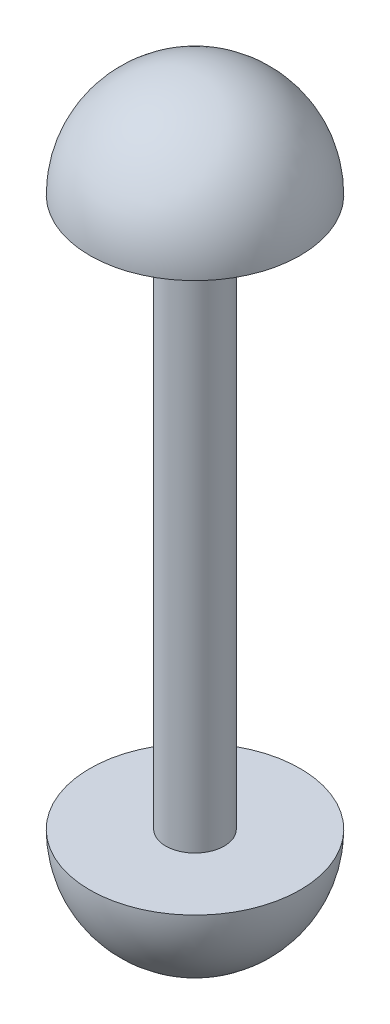
ISO-10303-21;
HEADER;
FILE_DESCRIPTION(('STEP AP214'),'2;1');
FILE_NAME('part.step','',(''),(''),'','','');
FILE_SCHEMA(('AUTOMOTIVE_DESIGN { 1 0 10303 214 1 1 1 1 }'));
ENDSEC;
DATA;
#1=APPLICATION_CONTEXT('core data for automotive mechanical design processes');
#2=APPLICATION_PROTOCOL_DEFINITION('international standard','automotive_design',2000,#1);
#3=PRODUCT_CONTEXT('',#1,'mechanical');
#4=PRODUCT('Part','Part','',(#3));
#5=PRODUCT_RELATED_PRODUCT_CATEGORY('part','',(#4));
#6=PRODUCT_DEFINITION_FORMATION('','',#4);
#7=PRODUCT_DEFINITION_CONTEXT('part definition',#1,'design');
#8=PRODUCT_DEFINITION('design','',#6,#7);
#9=PRODUCT_DEFINITION_SHAPE('','',#8);
#10=(LENGTH_UNIT() NAMED_UNIT(*) SI_UNIT(.MILLI.,.METRE.));
#11=(NAMED_UNIT(*) PLANE_ANGLE_UNIT() SI_UNIT($,.RADIAN.));
#12=(NAMED_UNIT(*) SI_UNIT($,.STERADIAN.) SOLID_ANGLE_UNIT());
#13=UNCERTAINTY_MEASURE_WITH_UNIT(LENGTH_MEASURE(1.E-05),#10,'distance_accuracy_value','');
#14=(GEOMETRIC_REPRESENTATION_CONTEXT(3) GLOBAL_UNCERTAINTY_ASSIGNED_CONTEXT((#13)) GLOBAL_UNIT_ASSIGNED_CONTEXT((#10,
#11,#12)) REPRESENTATION_CONTEXT('',''));
#15=CARTESIAN_POINT('',(0.,0.,0.));
#16=DIRECTION('',(0.,0.,1.));
#17=DIRECTION('',(1.,0.,0.));
#18=AXIS2_PLACEMENT_3D('',#15,#16,#17);
#19=CARTESIAN_POINT('',(0.,-94.,0.));
#20=DIRECTION('',(0.,1.,0.));
#21=DIRECTION('',(1.,0.,0.));
#22=AXIS2_PLACEMENT_3D('',#19,#20,#21);
#23=SPHERICAL_SURFACE('',#22,18.);
#24=CARTESIAN_POINT('',(0.,-94.,0.));
#25=DIRECTION('',(0.,1.,0.));
#26=DIRECTION('',(0.,0.,1.));
#27=AXIS2_PLACEMENT_3D('',#24,#25,#26);
#28=CIRCLE('',#27,18.);
#29=CARTESIAN_POINT('',(0.,-94.,18.));
#30=VERTEX_POINT('',#29);
#31=EDGE_CURVE('E10',#30,#30,#28,.T.);
#32=ORIENTED_EDGE('',*,*,#31,.F.);
#33=EDGE_LOOP('',(#32));
#34=FACE_BOUND('',#33,.T.);
#35=ADVANCED_FACE('F30',(#34),#23,.T.);
#36=CARTESIAN_POINT('',(-18.,-94.,0.));
#37=DIRECTION('',(0.,-1.,0.));
#38=DIRECTION('',(0.,0.,-1.));
#39=AXIS2_PLACEMENT_3D('',#36,#37,#38);
#40=PLANE('',#39);
#41=CARTESIAN_POINT('',(0.,-94.,0.));
#42=DIRECTION('',(0.,1.,0.));
#43=DIRECTION('',(0.,0.,1.));
#44=AXIS2_PLACEMENT_3D('',#41,#42,#43);
#45=CIRCLE('',#44,5.);
#46=CARTESIAN_POINT('',(0.,-94.,5.));
#47=VERTEX_POINT('',#46);
#48=EDGE_CURVE('E36',#47,#47,#45,.T.);
#49=ORIENTED_EDGE('',*,*,#48,.F.);
#50=EDGE_LOOP('',(#49));
#51=FACE_BOUND('',#50,.T.);
#52=ORIENTED_EDGE('',*,*,#31,.T.);
#53=EDGE_LOOP('',(#52));
#54=FACE_BOUND('',#53,.T.);
#55=ADVANCED_FACE('F62',(#51,#54),#40,.F.);
#56=CARTESIAN_POINT('',(0.,18.,0.));
#57=DIRECTION('',(0.,1.,0.));
#58=DIRECTION('',(0.,0.,1.));
#59=AXIS2_PLACEMENT_3D('',#56,#57,#58);
#60=CYLINDRICAL_SURFACE('',#59,5.);
#61=ORIENTED_EDGE('',*,*,#48,.T.);
#62=EDGE_LOOP('',(#61));
#63=FACE_BOUND('',#62,.T.);
#64=CARTESIAN_POINT('',(0.,0.,0.));
#65=DIRECTION('',(0.,1.,0.));
#66=DIRECTION('',(0.,0.,1.));
#67=AXIS2_PLACEMENT_3D('',#64,#65,#66);
#68=CIRCLE('',#67,5.);
#69=CARTESIAN_POINT('',(0.,0.,5.));
#70=VERTEX_POINT('',#69);
#71=EDGE_CURVE('E40',#70,#70,#68,.T.);
#72=ORIENTED_EDGE('',*,*,#71,.F.);
#73=EDGE_LOOP('',(#72));
#74=FACE_BOUND('',#73,.T.);
#75=ADVANCED_FACE('F54',(#63,#74),#60,.T.);
#76=CARTESIAN_POINT('',(-18.,0.,0.));
#77=DIRECTION('',(0.,-1.,0.));
#78=DIRECTION('',(0.,0.,-1.));
#79=AXIS2_PLACEMENT_3D('',#76,#77,#78);
#80=PLANE('',#79);
#81=ORIENTED_EDGE('',*,*,#71,.T.);
#82=EDGE_LOOP('',(#81));
#83=FACE_BOUND('',#82,.T.);
#84=CARTESIAN_POINT('',(0.,0.,0.));
#85=DIRECTION('',(0.,1.,0.));
#86=DIRECTION('',(0.,0.,1.));
#87=AXIS2_PLACEMENT_3D('',#84,#85,#86);
#88=CIRCLE('',#87,18.);
#89=CARTESIAN_POINT('',(0.,0.,18.));
#90=VERTEX_POINT('',#89);
#91=EDGE_CURVE('E44',#90,#90,#88,.T.);
#92=ORIENTED_EDGE('',*,*,#91,.F.);
#93=EDGE_LOOP('',(#92));
#94=FACE_BOUND('',#93,.T.);
#95=ADVANCED_FACE('F52',(#83,#94),#80,.T.);
#96=CARTESIAN_POINT('',(0.,0.,0.));
#97=DIRECTION('',(0.,1.,0.));
#98=DIRECTION('',(1.,0.,0.));
#99=AXIS2_PLACEMENT_3D('',#96,#97,#98);
#100=SPHERICAL_SURFACE('',#99,18.);
#101=ORIENTED_EDGE('',*,*,#91,.T.);
#102=EDGE_LOOP('',(#101));
#103=FACE_BOUND('',#102,.T.);
#104=ADVANCED_FACE('F50',(#103),#100,.T.);
#105=CLOSED_SHELL('',(#35,#55,#75,#95,#104));
#106=MANIFOLD_SOLID_BREP('B2',#105);
#107=ADVANCED_BREP_SHAPE_REPRESENTATION('',(#18,#106),#14);
#108=SHAPE_DEFINITION_REPRESENTATION(#9,#107);
ENDSEC;
END-ISO-10303-21;
